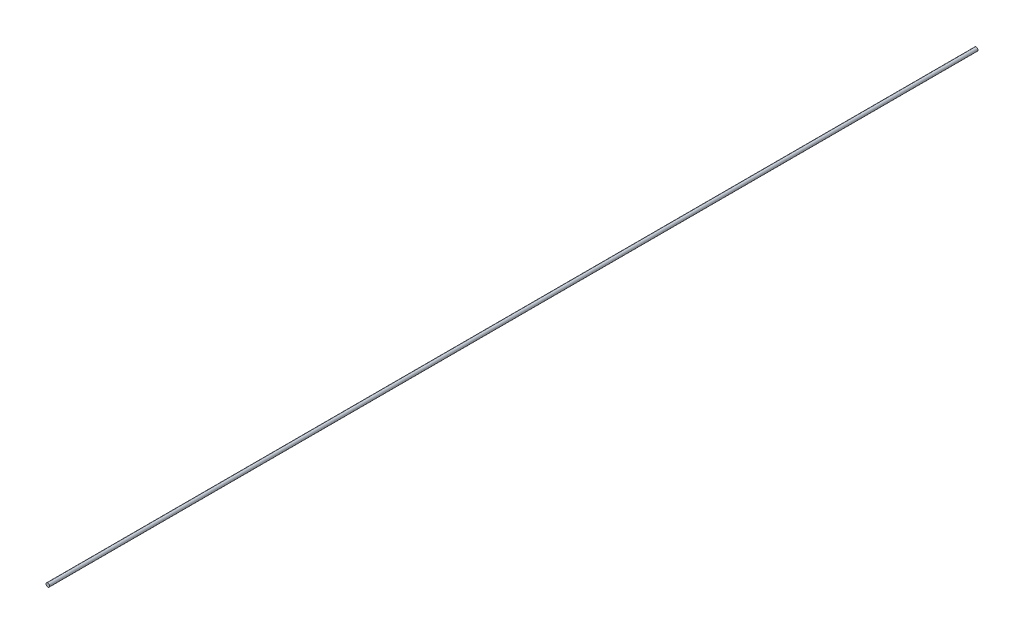
ISO-10303-21;
HEADER;
FILE_DESCRIPTION(('STEP AP214'),'2;1');
FILE_NAME('part.step','',(''),(''),'','','');
FILE_SCHEMA(('AUTOMOTIVE_DESIGN { 1 0 10303 214 1 1 1 1 }'));
ENDSEC;
DATA;
#1=APPLICATION_CONTEXT('core data for automotive mechanical design processes');
#2=APPLICATION_PROTOCOL_DEFINITION('international standard','automotive_design',2000,#1);
#3=PRODUCT_CONTEXT('',#1,'mechanical');
#4=PRODUCT('Part','Part','',(#3));
#5=PRODUCT_RELATED_PRODUCT_CATEGORY('part','',(#4));
#6=PRODUCT_DEFINITION_FORMATION('','',#4);
#7=PRODUCT_DEFINITION_CONTEXT('part definition',#1,'design');
#8=PRODUCT_DEFINITION('design','',#6,#7);
#9=PRODUCT_DEFINITION_SHAPE('','',#8);
#10=(LENGTH_UNIT() NAMED_UNIT(*) SI_UNIT(.MILLI.,.METRE.));
#11=(NAMED_UNIT(*) PLANE_ANGLE_UNIT() SI_UNIT($,.RADIAN.));
#12=(NAMED_UNIT(*) SI_UNIT($,.STERADIAN.) SOLID_ANGLE_UNIT());
#13=UNCERTAINTY_MEASURE_WITH_UNIT(LENGTH_MEASURE(1.E-05),#10,'distance_accuracy_value','');
#14=(GEOMETRIC_REPRESENTATION_CONTEXT(3) GLOBAL_UNCERTAINTY_ASSIGNED_CONTEXT((#13)) GLOBAL_UNIT_ASSIGNED_CONTEXT((#10,
#11,#12)) REPRESENTATION_CONTEXT('',''));
#15=CARTESIAN_POINT('',(0.,0.,0.));
#16=DIRECTION('',(0.,0.,1.));
#17=DIRECTION('',(1.,0.,0.));
#18=AXIS2_PLACEMENT_3D('',#15,#16,#17);
#19=CARTESIAN_POINT('',(0.,0.,33.02));
#20=DIRECTION('',(0.,0.,1.));
#21=DIRECTION('',(1.,0.,0.));
#22=AXIS2_PLACEMENT_3D('',#19,#20,#21);
#23=PLANE('',#22);
#24=CARTESIAN_POINT('',(0.,0.,33.02));
#25=DIRECTION('',(0.,0.,-1.));
#26=DIRECTION('',(-1.,0.,0.));
#27=AXIS2_PLACEMENT_3D('',#24,#25,#26);
#28=CIRCLE('',#27,0.0635);
#29=CARTESIAN_POINT('',(-0.0635,0.,33.02));
#30=VERTEX_POINT('',#29);
#31=EDGE_CURVE('E18',#30,#30,#28,.T.);
#32=ORIENTED_EDGE('',*,*,#31,.F.);
#33=EDGE_LOOP('',(#32));
#34=FACE_BOUND('',#33,.T.);
#35=ADVANCED_FACE('F15',(#34),#23,.T.);
#36=CARTESIAN_POINT('',(0.,0.,0.));
#37=DIRECTION('',(0.,0.,1.));
#38=DIRECTION('',(1.,0.,0.));
#39=AXIS2_PLACEMENT_3D('',#36,#37,#38);
#40=PLANE('',#39);
#41=CARTESIAN_POINT('',(0.,0.,0.));
#42=DIRECTION('',(0.,0.,-1.));
#43=DIRECTION('',(-1.,0.,0.));
#44=AXIS2_PLACEMENT_3D('',#41,#42,#43);
#45=CIRCLE('',#44,0.0635);
#46=CARTESIAN_POINT('',(-0.0635,0.,0.));
#47=VERTEX_POINT('',#46);
#48=EDGE_CURVE('E10',#47,#47,#45,.F.);
#49=ORIENTED_EDGE('',*,*,#48,.F.);
#50=EDGE_LOOP('',(#49));
#51=FACE_BOUND('',#50,.T.);
#52=ADVANCED_FACE('F30',(#51),#40,.F.);
#53=CARTESIAN_POINT('',(0.,0.,33.02));
#54=DIRECTION('',(0.,0.,-1.));
#55=DIRECTION('',(-1.,0.,0.));
#56=AXIS2_PLACEMENT_3D('',#53,#54,#55);
#57=CYLINDRICAL_SURFACE('',#56,0.0635);
#58=ORIENTED_EDGE('',*,*,#48,.T.);
#59=EDGE_LOOP('',(#58));
#60=FACE_BOUND('',#59,.T.);
#61=ORIENTED_EDGE('',*,*,#31,.T.);
#62=EDGE_LOOP('',(#61));
#63=FACE_BOUND('',#62,.T.);
#64=ADVANCED_FACE('F27',(#60,#63),#57,.T.);
#65=CLOSED_SHELL('',(#35,#52,#64));
#66=MANIFOLD_SOLID_BREP('B1',#65);
#67=ADVANCED_BREP_SHAPE_REPRESENTATION('',(#18,#66),#14);
#68=SHAPE_DEFINITION_REPRESENTATION(#9,#67);
ENDSEC;
END-ISO-10303-21;
